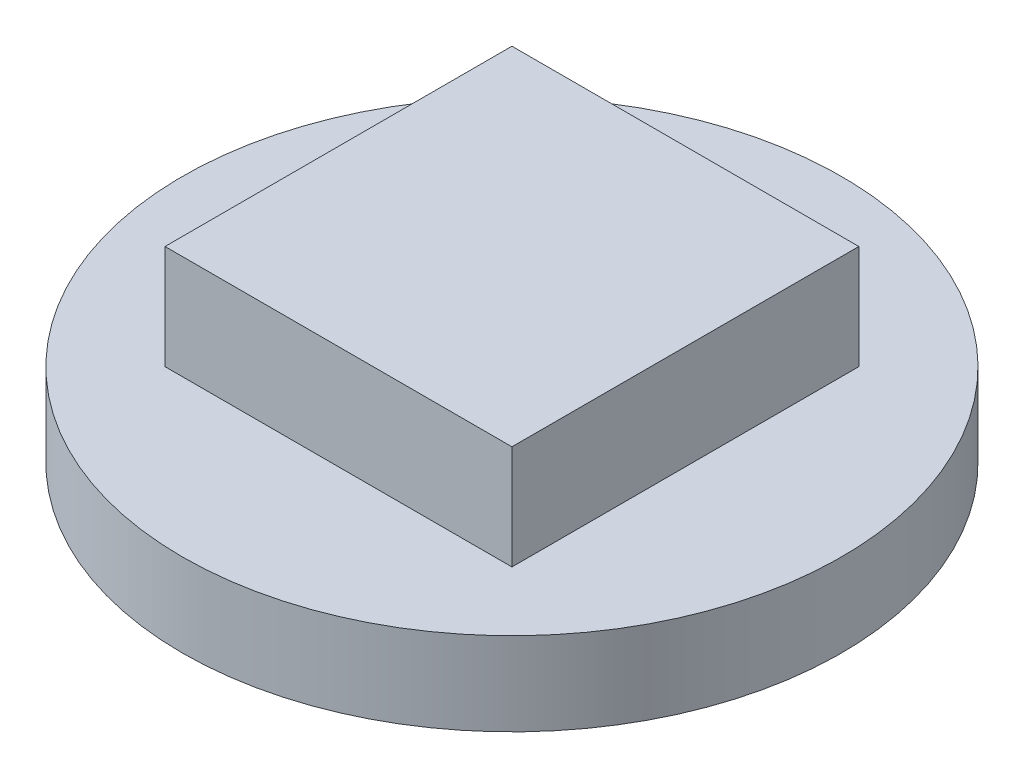
ISO-10303-21;
HEADER;
FILE_DESCRIPTION(('STEP AP214'),'2;1');
FILE_NAME('part.step','',(''),(''),'','','');
FILE_SCHEMA(('AUTOMOTIVE_DESIGN { 1 0 10303 214 1 1 1 1 }'));
ENDSEC;
DATA;
#1=APPLICATION_CONTEXT('core data for automotive mechanical design processes');
#2=APPLICATION_PROTOCOL_DEFINITION('international standard','automotive_design',2000,#1);
#3=PRODUCT_CONTEXT('',#1,'mechanical');
#4=PRODUCT('Part','Part','',(#3));
#5=PRODUCT_RELATED_PRODUCT_CATEGORY('part','',(#4));
#6=PRODUCT_DEFINITION_FORMATION('','',#4);
#7=PRODUCT_DEFINITION_CONTEXT('part definition',#1,'design');
#8=PRODUCT_DEFINITION('design','',#6,#7);
#9=PRODUCT_DEFINITION_SHAPE('','',#8);
#10=(LENGTH_UNIT() NAMED_UNIT(*) SI_UNIT(.MILLI.,.METRE.));
#11=(NAMED_UNIT(*) PLANE_ANGLE_UNIT() SI_UNIT($,.RADIAN.));
#12=(NAMED_UNIT(*) SI_UNIT($,.STERADIAN.) SOLID_ANGLE_UNIT());
#13=UNCERTAINTY_MEASURE_WITH_UNIT(LENGTH_MEASURE(1.E-05),#10,'distance_accuracy_value','');
#14=(GEOMETRIC_REPRESENTATION_CONTEXT(3) GLOBAL_UNCERTAINTY_ASSIGNED_CONTEXT((#13)) GLOBAL_UNIT_ASSIGNED_CONTEXT((#10,
#11,#12)) REPRESENTATION_CONTEXT('',''));
#15=CARTESIAN_POINT('',(0.,0.,0.));
#16=DIRECTION('',(0.,0.,1.));
#17=DIRECTION('',(1.,0.,0.));
#18=AXIS2_PLACEMENT_3D('',#15,#16,#17);
#19=CARTESIAN_POINT('',(0.,-1.2,0.));
#20=DIRECTION('',(0.,1.,0.));
#21=DIRECTION('',(0.,0.,1.));
#22=AXIS2_PLACEMENT_3D('',#19,#20,#21);
#23=CYLINDRICAL_SURFACE('',#22,4.75);
#24=CARTESIAN_POINT('',(0.,-1.2,0.));
#25=DIRECTION('',(0.,1.,0.));
#26=DIRECTION('',(0.,0.,1.));
#27=AXIS2_PLACEMENT_3D('',#24,#25,#26);
#28=CIRCLE('',#27,4.75);
#29=CARTESIAN_POINT('',(0.,-1.2,4.75));
#30=VERTEX_POINT('',#29);
#31=EDGE_CURVE('E11',#30,#30,#28,.T.);
#32=ORIENTED_EDGE('',*,*,#31,.T.);
#33=EDGE_LOOP('',(#32));
#34=FACE_BOUND('',#33,.T.);
#35=CARTESIAN_POINT('',(0.,0.,0.));
#36=DIRECTION('',(0.,1.,0.));
#37=DIRECTION('',(0.,0.,1.));
#38=AXIS2_PLACEMENT_3D('',#35,#36,#37);
#39=CIRCLE('',#38,4.75);
#40=CARTESIAN_POINT('',(0.,0.,4.75));
#41=VERTEX_POINT('',#40);
#42=EDGE_CURVE('E42',#41,#41,#39,.T.);
#43=ORIENTED_EDGE('',*,*,#42,.F.);
#44=EDGE_LOOP('',(#43));
#45=FACE_BOUND('',#44,.T.);
#46=ADVANCED_FACE('F39',(#34,#45),#23,.T.);
#47=CARTESIAN_POINT('',(0.,-1.2,0.));
#48=DIRECTION('',(0.,1.,0.));
#49=DIRECTION('',(0.,0.,1.));
#50=AXIS2_PLACEMENT_3D('',#47,#48,#49);
#51=PLANE('',#50);
#52=ORIENTED_EDGE('',*,*,#31,.F.);
#53=EDGE_LOOP('',(#52));
#54=FACE_BOUND('',#53,.T.);
#55=ADVANCED_FACE('F150',(#54),#51,.F.);
#56=CARTESIAN_POINT('',(0.,0.,0.));
#57=DIRECTION('',(0.,1.,0.));
#58=DIRECTION('',(0.,0.,1.));
#59=AXIS2_PLACEMENT_3D('',#56,#57,#58);
#60=PLANE('',#59);
#61=DIRECTION('',(0.,0.,-1.));
#62=VECTOR('',#61,1.);
#63=CARTESIAN_POINT('',(2.5,0.,2.5));
#64=LINE('',#63,#62);
#65=CARTESIAN_POINT('',(2.5,0.,2.5));
#66=VERTEX_POINT('',#65);
#67=CARTESIAN_POINT('',(2.5,0.,-2.5));
#68=VERTEX_POINT('',#67);
#69=EDGE_CURVE('E56',#66,#68,#64,.T.);
#70=ORIENTED_EDGE('',*,*,#69,.F.);
#71=DIRECTION('',(1.,0.,0.));
#72=VECTOR('',#71,1.);
#73=CARTESIAN_POINT('',(-2.5,0.,2.5));
#74=LINE('',#73,#72);
#75=CARTESIAN_POINT('',(-2.5,0.,2.5));
#76=VERTEX_POINT('',#75);
#77=EDGE_CURVE('E61',#76,#66,#74,.T.);
#78=ORIENTED_EDGE('',*,*,#77,.F.);
#79=DIRECTION('',(0.,0.,1.));
#80=VECTOR('',#79,1.);
#81=CARTESIAN_POINT('',(-2.5,0.,2.5));
#82=LINE('',#81,#80);
#83=CARTESIAN_POINT('',(-2.5,0.,-2.5));
#84=VERTEX_POINT('',#83);
#85=EDGE_CURVE('E126',#84,#76,#82,.T.);
#86=ORIENTED_EDGE('',*,*,#85,.F.);
#87=DIRECTION('',(-1.,0.,0.));
#88=VECTOR('',#87,1.);
#89=CARTESIAN_POINT('',(-2.5,0.,-2.5));
#90=LINE('',#89,#88);
#91=EDGE_CURVE('E129',#68,#84,#90,.T.);
#92=ORIENTED_EDGE('',*,*,#91,.F.);
#93=EDGE_LOOP('',(#70,#78,#86,#92));
#94=FACE_BOUND('',#93,.T.);
#95=ORIENTED_EDGE('',*,*,#42,.T.);
#96=EDGE_LOOP('',(#95));
#97=FACE_BOUND('',#96,.T.);
#98=ADVANCED_FACE('F155',(#94,#97),#60,.T.);
#99=CARTESIAN_POINT('',(2.5,1.5,2.5));
#100=DIRECTION('',(-1.,0.,0.));
#101=DIRECTION('',(0.,0.,1.));
#102=AXIS2_PLACEMENT_3D('',#99,#100,#101);
#103=PLANE('',#102);
#104=ORIENTED_EDGE('',*,*,#69,.T.);
#105=DIRECTION('',(0.,-1.,0.));
#106=VECTOR('',#105,1.);
#107=CARTESIAN_POINT('',(2.5,1.5,-2.5));
#108=LINE('',#107,#106);
#109=CARTESIAN_POINT('',(2.5,1.5,-2.5));
#110=VERTEX_POINT('',#109);
#111=EDGE_CURVE('E90',#110,#68,#108,.T.);
#112=ORIENTED_EDGE('',*,*,#111,.F.);
#113=DIRECTION('',(0.,0.,-1.));
#114=VECTOR('',#113,1.);
#115=CARTESIAN_POINT('',(2.5,1.5,2.5));
#116=LINE('',#115,#114);
#117=CARTESIAN_POINT('',(2.5,1.5,2.5));
#118=VERTEX_POINT('',#117);
#119=EDGE_CURVE('E97',#118,#110,#116,.T.);
#120=ORIENTED_EDGE('',*,*,#119,.F.);
#121=DIRECTION('',(0.,-1.,0.));
#122=VECTOR('',#121,1.);
#123=CARTESIAN_POINT('',(2.5,1.5,2.5));
#124=LINE('',#123,#122);
#125=EDGE_CURVE('E121',#118,#66,#124,.T.);
#126=ORIENTED_EDGE('',*,*,#125,.T.);
#127=EDGE_LOOP('',(#104,#112,#120,#126));
#128=FACE_BOUND('',#127,.T.);
#129=ADVANCED_FACE('F108',(#128),#103,.F.);
#130=CARTESIAN_POINT('',(-2.5,1.5,-2.5));
#131=DIRECTION('',(0.,0.,1.));
#132=DIRECTION('',(1.,0.,0.));
#133=AXIS2_PLACEMENT_3D('',#130,#131,#132);
#134=PLANE('',#133);
#135=ORIENTED_EDGE('',*,*,#91,.T.);
#136=DIRECTION('',(0.,-1.,0.));
#137=VECTOR('',#136,1.);
#138=CARTESIAN_POINT('',(-2.5,1.5,-2.5));
#139=LINE('',#138,#137);
#140=CARTESIAN_POINT('',(-2.5,1.5,-2.5));
#141=VERTEX_POINT('',#140);
#142=EDGE_CURVE('E92',#141,#84,#139,.T.);
#143=ORIENTED_EDGE('',*,*,#142,.F.);
#144=DIRECTION('',(-1.,0.,0.));
#145=VECTOR('',#144,1.);
#146=CARTESIAN_POINT('',(-2.5,1.5,-2.5));
#147=LINE('',#146,#145);
#148=EDGE_CURVE('E85',#110,#141,#147,.T.);
#149=ORIENTED_EDGE('',*,*,#148,.F.);
#150=ORIENTED_EDGE('',*,*,#111,.T.);
#151=EDGE_LOOP('',(#135,#143,#149,#150));
#152=FACE_BOUND('',#151,.T.);
#153=ADVANCED_FACE('F88',(#152),#134,.F.);
#154=CARTESIAN_POINT('',(-2.5,1.5,2.5));
#155=DIRECTION('',(1.,0.,0.));
#156=DIRECTION('',(0.,0.,-1.));
#157=AXIS2_PLACEMENT_3D('',#154,#155,#156);
#158=PLANE('',#157);
#159=ORIENTED_EDGE('',*,*,#85,.T.);
#160=DIRECTION('',(0.,-1.,0.));
#161=VECTOR('',#160,1.);
#162=CARTESIAN_POINT('',(-2.5,1.5,2.5));
#163=LINE('',#162,#161);
#164=CARTESIAN_POINT('',(-2.5,1.5,2.5));
#165=VERTEX_POINT('',#164);
#166=EDGE_CURVE('E115',#165,#76,#163,.T.);
#167=ORIENTED_EDGE('',*,*,#166,.F.);
#168=DIRECTION('',(0.,0.,1.));
#169=VECTOR('',#168,1.);
#170=CARTESIAN_POINT('',(-2.5,1.5,2.5));
#171=LINE('',#170,#169);
#172=EDGE_CURVE('E96',#141,#165,#171,.T.);
#173=ORIENTED_EDGE('',*,*,#172,.F.);
#174=ORIENTED_EDGE('',*,*,#142,.T.);
#175=EDGE_LOOP('',(#159,#167,#173,#174));
#176=FACE_BOUND('',#175,.T.);
#177=ADVANCED_FACE('F138',(#176),#158,.F.);
#178=CARTESIAN_POINT('',(-2.5,1.5,2.5));
#179=DIRECTION('',(0.,0.,-1.));
#180=DIRECTION('',(-1.,0.,0.));
#181=AXIS2_PLACEMENT_3D('',#178,#179,#180);
#182=PLANE('',#181);
#183=ORIENTED_EDGE('',*,*,#77,.T.);
#184=ORIENTED_EDGE('',*,*,#125,.F.);
#185=DIRECTION('',(1.,0.,0.));
#186=VECTOR('',#185,1.);
#187=CARTESIAN_POINT('',(-2.5,1.5,2.5));
#188=LINE('',#187,#186);
#189=EDGE_CURVE('E102',#165,#118,#188,.T.);
#190=ORIENTED_EDGE('',*,*,#189,.F.);
#191=ORIENTED_EDGE('',*,*,#166,.T.);
#192=EDGE_LOOP('',(#183,#184,#190,#191));
#193=FACE_BOUND('',#192,.T.);
#194=ADVANCED_FACE('F140',(#193),#182,.F.);
#195=CARTESIAN_POINT('',(0.,1.5,0.));
#196=DIRECTION('',(0.,-1.,0.));
#197=DIRECTION('',(0.,0.,-1.));
#198=AXIS2_PLACEMENT_3D('',#195,#196,#197);
#199=PLANE('',#198);
#200=ORIENTED_EDGE('',*,*,#119,.T.);
#201=ORIENTED_EDGE('',*,*,#148,.T.);
#202=ORIENTED_EDGE('',*,*,#172,.T.);
#203=ORIENTED_EDGE('',*,*,#189,.T.);
#204=EDGE_LOOP('',(#200,#201,#202,#203));
#205=FACE_BOUND('',#204,.T.);
#206=ADVANCED_FACE('F100',(#205),#199,.F.);
#207=CLOSED_SHELL('',(#46,#55,#98,#129,#153,#177,#194,#206));
#208=MANIFOLD_SOLID_BREP('B2',#207);
#209=ADVANCED_BREP_SHAPE_REPRESENTATION('',(#18,#208),#14);
#210=SHAPE_DEFINITION_REPRESENTATION(#9,#209);
ENDSEC;
END-ISO-10303-21;
